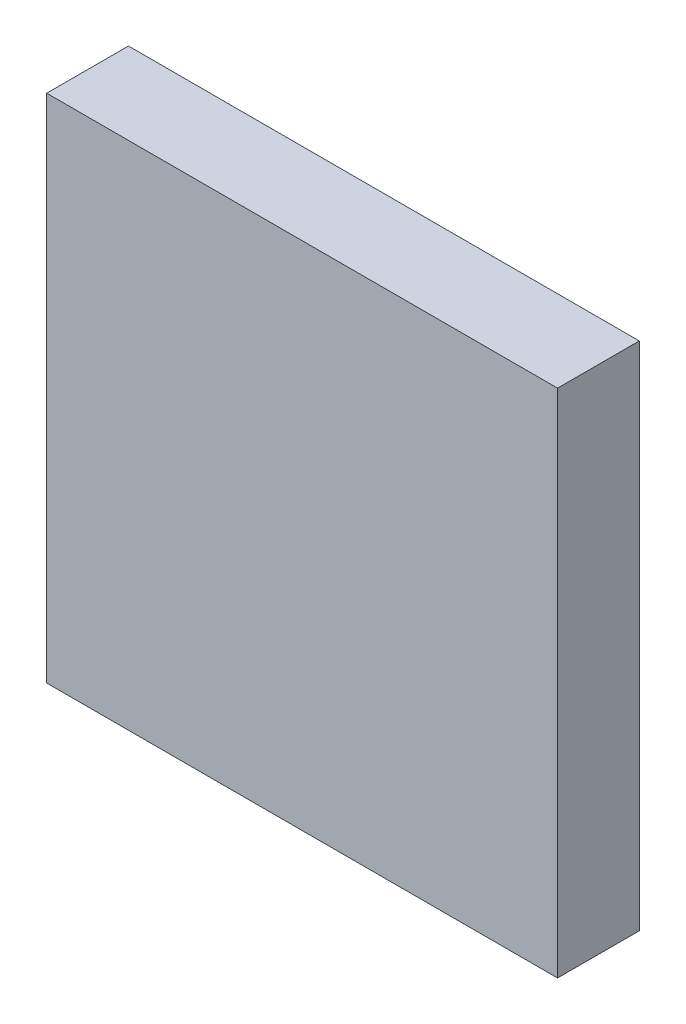
ISO-10303-21;
HEADER;
FILE_DESCRIPTION(('STEP AP214'),'2;1');
FILE_NAME('part.step','',(''),(''),'','','');
FILE_SCHEMA(('AUTOMOTIVE_DESIGN { 1 0 10303 214 1 1 1 1 }'));
ENDSEC;
DATA;
#1=APPLICATION_CONTEXT('core data for automotive mechanical design processes');
#2=APPLICATION_PROTOCOL_DEFINITION('international standard','automotive_design',2000,#1);
#3=PRODUCT_CONTEXT('',#1,'mechanical');
#4=PRODUCT('Part','Part','',(#3));
#5=PRODUCT_RELATED_PRODUCT_CATEGORY('part','',(#4));
#6=PRODUCT_DEFINITION_FORMATION('','',#4);
#7=PRODUCT_DEFINITION_CONTEXT('part definition',#1,'design');
#8=PRODUCT_DEFINITION('design','',#6,#7);
#9=PRODUCT_DEFINITION_SHAPE('','',#8);
#10=(LENGTH_UNIT() NAMED_UNIT(*) SI_UNIT(.MILLI.,.METRE.));
#11=(NAMED_UNIT(*) PLANE_ANGLE_UNIT() SI_UNIT($,.RADIAN.));
#12=(NAMED_UNIT(*) SI_UNIT($,.STERADIAN.) SOLID_ANGLE_UNIT());
#13=UNCERTAINTY_MEASURE_WITH_UNIT(LENGTH_MEASURE(1.E-05),#10,'distance_accuracy_value','');
#14=(GEOMETRIC_REPRESENTATION_CONTEXT(3) GLOBAL_UNCERTAINTY_ASSIGNED_CONTEXT((#13)) GLOBAL_UNIT_ASSIGNED_CONTEXT((#10,
#11,#12)) REPRESENTATION_CONTEXT('',''));
#15=CARTESIAN_POINT('',(0.,0.,0.));
#16=DIRECTION('',(0.,0.,1.));
#17=DIRECTION('',(1.,0.,0.));
#18=AXIS2_PLACEMENT_3D('',#15,#16,#17);
#19=CARTESIAN_POINT('',(0.,0.,8.));
#20=DIRECTION('',(1.,0.,0.));
#21=DIRECTION('',(0.,0.,-1.));
#22=AXIS2_PLACEMENT_3D('',#19,#20,#21);
#23=PLANE('',#22);
#24=DIRECTION('',(0.,-1.,0.));
#25=VECTOR('',#24,1.);
#26=CARTESIAN_POINT('',(0.,0.,0.));
#27=LINE('',#26,#25);
#28=CARTESIAN_POINT('',(0.,50.,0.));
#29=VERTEX_POINT('',#28);
#30=CARTESIAN_POINT('',(0.,0.,0.));
#31=VERTEX_POINT('',#30);
#32=EDGE_CURVE('E105',#29,#31,#27,.T.);
#33=ORIENTED_EDGE('',*,*,#32,.T.);
#34=DIRECTION('',(0.,0.,-1.));
#35=VECTOR('',#34,1.);
#36=CARTESIAN_POINT('',(0.,0.,8.));
#37=LINE('',#36,#35);
#38=CARTESIAN_POINT('',(0.,0.,8.));
#39=VERTEX_POINT('',#38);
#40=EDGE_CURVE('E11',#39,#31,#37,.T.);
#41=ORIENTED_EDGE('',*,*,#40,.F.);
#42=DIRECTION('',(0.,-1.,0.));
#43=VECTOR('',#42,1.);
#44=CARTESIAN_POINT('',(0.,0.,8.));
#45=LINE('',#44,#43);
#46=CARTESIAN_POINT('',(0.,50.,8.));
#47=VERTEX_POINT('',#46);
#48=EDGE_CURVE('E114',#47,#39,#45,.T.);
#49=ORIENTED_EDGE('',*,*,#48,.F.);
#50=DIRECTION('',(0.,0.,-1.));
#51=VECTOR('',#50,1.);
#52=CARTESIAN_POINT('',(0.,50.,8.));
#53=LINE('',#52,#51);
#54=EDGE_CURVE('E119',#47,#29,#53,.T.);
#55=ORIENTED_EDGE('',*,*,#54,.T.);
#56=EDGE_LOOP('',(#33,#41,#49,#55));
#57=FACE_BOUND('',#56,.T.);
#58=ADVANCED_FACE('F44',(#57),#23,.F.);
#59=CARTESIAN_POINT('',(0.,0.,8.));
#60=DIRECTION('',(0.,1.,0.));
#61=DIRECTION('',(0.,0.,1.));
#62=AXIS2_PLACEMENT_3D('',#59,#60,#61);
#63=PLANE('',#62);
#64=CARTESIAN_POINT('',(25.,0.,4.));
#65=DIRECTION('',(0.,-1.,0.));
#66=DIRECTION('',(0.,0.,-1.));
#67=AXIS2_PLACEMENT_3D('',#64,#65,#66);
#68=CIRCLE('',#67,2.49999999999999);
#69=CARTESIAN_POINT('',(25.,0.,1.50000000000001));
#70=VERTEX_POINT('',#69);
#71=EDGE_CURVE('E106',#70,#70,#68,.T.);
#72=ORIENTED_EDGE('',*,*,#71,.F.);
#73=EDGE_LOOP('',(#72));
#74=FACE_BOUND('',#73,.T.);
#75=DIRECTION('',(1.,0.,0.));
#76=VECTOR('',#75,1.);
#77=CARTESIAN_POINT('',(0.,0.,0.));
#78=LINE('',#77,#76);
#79=CARTESIAN_POINT('',(50.,0.,0.));
#80=VERTEX_POINT('',#79);
#81=EDGE_CURVE('E109',#31,#80,#78,.T.);
#82=ORIENTED_EDGE('',*,*,#81,.T.);
#83=DIRECTION('',(0.,0.,-1.));
#84=VECTOR('',#83,1.);
#85=CARTESIAN_POINT('',(50.,0.,8.));
#86=LINE('',#85,#84);
#87=CARTESIAN_POINT('',(50.,0.,8.));
#88=VERTEX_POINT('',#87);
#89=EDGE_CURVE('E52',#88,#80,#86,.T.);
#90=ORIENTED_EDGE('',*,*,#89,.F.);
#91=DIRECTION('',(1.,0.,0.));
#92=VECTOR('',#91,1.);
#93=CARTESIAN_POINT('',(0.,0.,8.));
#94=LINE('',#93,#92);
#95=EDGE_CURVE('E91',#39,#88,#94,.T.);
#96=ORIENTED_EDGE('',*,*,#95,.F.);
#97=ORIENTED_EDGE('',*,*,#40,.T.);
#98=EDGE_LOOP('',(#82,#90,#96,#97));
#99=FACE_BOUND('',#98,.T.);
#100=ADVANCED_FACE('F142',(#74,#99),#63,.F.);
#101=CARTESIAN_POINT('',(50.,0.,8.));
#102=DIRECTION('',(-1.,0.,0.));
#103=DIRECTION('',(0.,0.,1.));
#104=AXIS2_PLACEMENT_3D('',#101,#102,#103);
#105=PLANE('',#104);
#106=DIRECTION('',(0.,1.,0.));
#107=VECTOR('',#106,1.);
#108=CARTESIAN_POINT('',(50.,0.,0.));
#109=LINE('',#108,#107);
#110=CARTESIAN_POINT('',(50.,50.,0.));
#111=VERTEX_POINT('',#110);
#112=EDGE_CURVE('E78',#80,#111,#109,.T.);
#113=ORIENTED_EDGE('',*,*,#112,.T.);
#114=DIRECTION('',(0.,0.,-1.));
#115=VECTOR('',#114,1.);
#116=CARTESIAN_POINT('',(50.,50.,8.));
#117=LINE('',#116,#115);
#118=CARTESIAN_POINT('',(50.,50.,8.));
#119=VERTEX_POINT('',#118);
#120=EDGE_CURVE('E125',#119,#111,#117,.T.);
#121=ORIENTED_EDGE('',*,*,#120,.F.);
#122=DIRECTION('',(0.,1.,0.));
#123=VECTOR('',#122,1.);
#124=CARTESIAN_POINT('',(50.,0.,8.));
#125=LINE('',#124,#123);
#126=EDGE_CURVE('E117',#88,#119,#125,.T.);
#127=ORIENTED_EDGE('',*,*,#126,.F.);
#128=ORIENTED_EDGE('',*,*,#89,.T.);
#129=EDGE_LOOP('',(#113,#121,#127,#128));
#130=FACE_BOUND('',#129,.T.);
#131=ADVANCED_FACE('F127',(#130),#105,.F.);
#132=CARTESIAN_POINT('',(0.,50.,8.));
#133=DIRECTION('',(0.,-1.,0.));
#134=DIRECTION('',(0.,0.,-1.));
#135=AXIS2_PLACEMENT_3D('',#132,#133,#134);
#136=PLANE('',#135);
#137=DIRECTION('',(-1.,0.,0.));
#138=VECTOR('',#137,1.);
#139=CARTESIAN_POINT('',(0.,50.,0.));
#140=LINE('',#139,#138);
#141=EDGE_CURVE('E84',#111,#29,#140,.T.);
#142=ORIENTED_EDGE('',*,*,#141,.T.);
#143=ORIENTED_EDGE('',*,*,#54,.F.);
#144=DIRECTION('',(-1.,0.,0.));
#145=VECTOR('',#144,1.);
#146=CARTESIAN_POINT('',(0.,50.,8.));
#147=LINE('',#146,#145);
#148=EDGE_CURVE('E60',#119,#47,#147,.T.);
#149=ORIENTED_EDGE('',*,*,#148,.F.);
#150=ORIENTED_EDGE('',*,*,#120,.T.);
#151=EDGE_LOOP('',(#142,#143,#149,#150));
#152=FACE_BOUND('',#151,.T.);
#153=ADVANCED_FACE('F133',(#152),#136,.F.);
#154=CARTESIAN_POINT('',(0.,0.,8.));
#155=DIRECTION('',(0.,0.,-1.));
#156=DIRECTION('',(-1.,0.,0.));
#157=AXIS2_PLACEMENT_3D('',#154,#155,#156);
#158=PLANE('',#157);
#159=ORIENTED_EDGE('',*,*,#48,.T.);
#160=ORIENTED_EDGE('',*,*,#95,.T.);
#161=ORIENTED_EDGE('',*,*,#126,.T.);
#162=ORIENTED_EDGE('',*,*,#148,.T.);
#163=EDGE_LOOP('',(#159,#160,#161,#162));
#164=FACE_BOUND('',#163,.T.);
#165=ADVANCED_FACE('F135',(#164),#158,.F.);
#166=CARTESIAN_POINT('',(0.,0.,0.));
#167=DIRECTION('',(0.,0.,-1.));
#168=DIRECTION('',(-1.,0.,0.));
#169=AXIS2_PLACEMENT_3D('',#166,#167,#168);
#170=PLANE('',#169);
#171=ORIENTED_EDGE('',*,*,#32,.F.);
#172=ORIENTED_EDGE('',*,*,#141,.F.);
#173=ORIENTED_EDGE('',*,*,#112,.F.);
#174=ORIENTED_EDGE('',*,*,#81,.F.);
#175=EDGE_LOOP('',(#171,#172,#173,#174));
#176=FACE_BOUND('',#175,.T.);
#177=ADVANCED_FACE('F99',(#176),#170,.T.);
#178=CARTESIAN_POINT('',(25.,14.,4.));
#179=DIRECTION('',(0.,-1.,0.));
#180=DIRECTION('',(0.,0.,-1.));
#181=AXIS2_PLACEMENT_3D('',#178,#179,#180);
#182=CONICAL_SURFACE('',#181,2.49999999999999,1.02974425867665);
#183=CARTESIAN_POINT('',(25.,15.5021515475689,4.));
#184=VERTEX_POINT('',#183);
#185=VERTEX_LOOP('',#184);
#186=FACE_BOUND('',#185,.T.);
#187=CARTESIAN_POINT('',(25.,14.,4.));
#188=DIRECTION('',(0.,-1.,0.));
#189=DIRECTION('',(0.,0.,-1.));
#190=AXIS2_PLACEMENT_3D('',#187,#188,#189);
#191=CIRCLE('',#190,2.49999999999999);
#192=CARTESIAN_POINT('',(25.,14.,1.50000000000001));
#193=VERTEX_POINT('',#192);
#194=EDGE_CURVE('E103',#193,#193,#191,.T.);
#195=ORIENTED_EDGE('',*,*,#194,.T.);
#196=EDGE_LOOP('',(#195));
#197=FACE_BOUND('',#196,.T.);
#198=ADVANCED_FACE('F95',(#186,#197),#182,.F.);
#199=CARTESIAN_POINT('',(25.,0.,4.));
#200=DIRECTION('',(0.,-1.,0.));
#201=DIRECTION('',(0.,0.,-1.));
#202=AXIS2_PLACEMENT_3D('',#199,#200,#201);
#203=CYLINDRICAL_SURFACE('',#202,2.49999999999999);
#204=ORIENTED_EDGE('',*,*,#194,.F.);
#205=EDGE_LOOP('',(#204));
#206=FACE_BOUND('',#205,.T.);
#207=ORIENTED_EDGE('',*,*,#71,.T.);
#208=EDGE_LOOP('',(#207));
#209=FACE_BOUND('',#208,.T.);
#210=ADVANCED_FACE('F98',(#206,#209),#203,.F.);
#211=CLOSED_SHELL('',(#58,#100,#131,#153,#165,#177,#198,#210));
#212=MANIFOLD_SOLID_BREP('B2',#211);
#213=ADVANCED_BREP_SHAPE_REPRESENTATION('',(#18,#212),#14);
#214=SHAPE_DEFINITION_REPRESENTATION(#9,#213);
ENDSEC;
END-ISO-10303-21;
